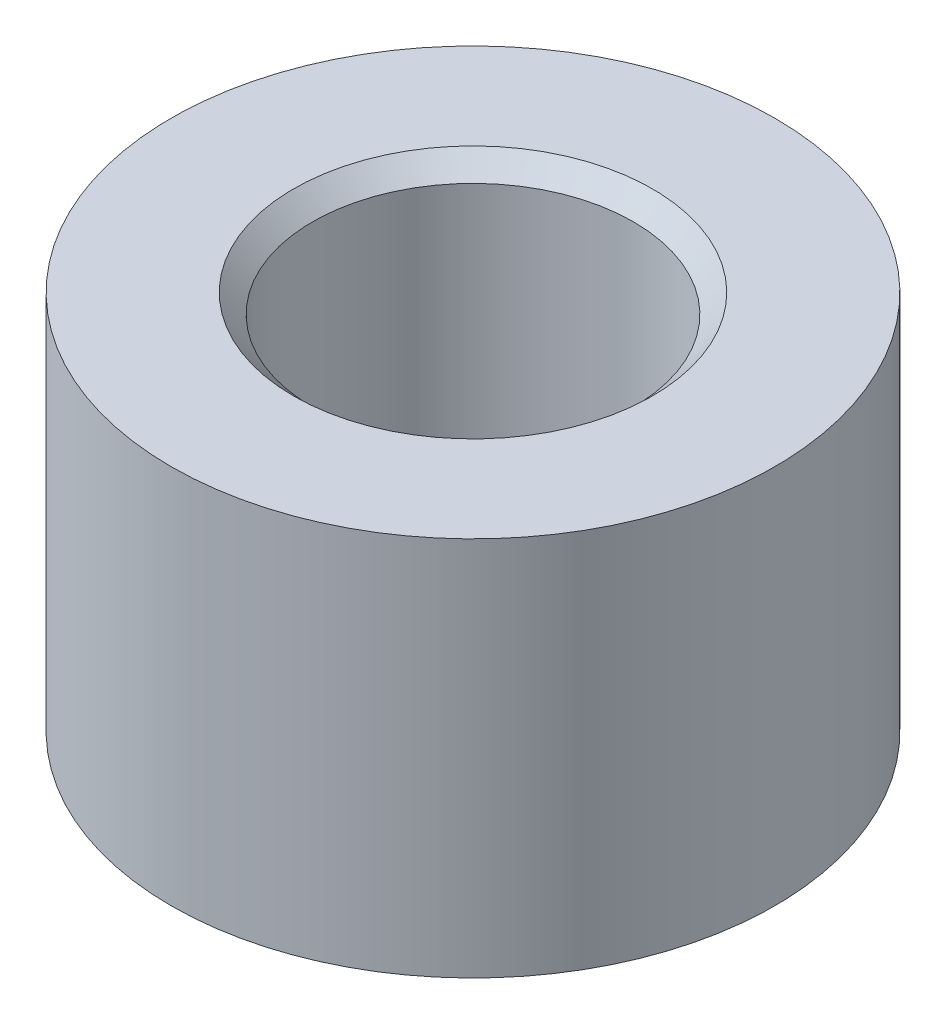
ISO-10303-21;
HEADER;
FILE_DESCRIPTION(('STEP AP214'),'2;1');
FILE_NAME('part.step','',(''),(''),'','','');
FILE_SCHEMA(('AUTOMOTIVE_DESIGN { 1 0 10303 214 1 1 1 1 }'));
ENDSEC;
DATA;
#1=APPLICATION_CONTEXT('core data for automotive mechanical design processes');
#2=APPLICATION_PROTOCOL_DEFINITION('international standard','automotive_design',2000,#1);
#3=PRODUCT_CONTEXT('',#1,'mechanical');
#4=PRODUCT('Part','Part','',(#3));
#5=PRODUCT_RELATED_PRODUCT_CATEGORY('part','',(#4));
#6=PRODUCT_DEFINITION_FORMATION('','',#4);
#7=PRODUCT_DEFINITION_CONTEXT('part definition',#1,'design');
#8=PRODUCT_DEFINITION('design','',#6,#7);
#9=PRODUCT_DEFINITION_SHAPE('','',#8);
#10=(LENGTH_UNIT() NAMED_UNIT(*) SI_UNIT(.MILLI.,.METRE.));
#11=(NAMED_UNIT(*) PLANE_ANGLE_UNIT() SI_UNIT($,.RADIAN.));
#12=(NAMED_UNIT(*) SI_UNIT($,.STERADIAN.) SOLID_ANGLE_UNIT());
#13=UNCERTAINTY_MEASURE_WITH_UNIT(LENGTH_MEASURE(1.E-05),#10,'distance_accuracy_value','');
#14=(GEOMETRIC_REPRESENTATION_CONTEXT(3) GLOBAL_UNCERTAINTY_ASSIGNED_CONTEXT((#13)) GLOBAL_UNIT_ASSIGNED_CONTEXT((#10,
#11,#12)) REPRESENTATION_CONTEXT('',''));
#15=CARTESIAN_POINT('',(0.,0.,0.));
#16=DIRECTION('',(0.,0.,1.));
#17=DIRECTION('',(1.,0.,0.));
#18=AXIS2_PLACEMENT_3D('',#15,#16,#17);
#19=CARTESIAN_POINT('',(0.,8.001,0.));
#20=DIRECTION('',(0.,1.,0.));
#21=DIRECTION('',(0.,0.,1.));
#22=AXIS2_PLACEMENT_3D('',#19,#20,#21);
#23=PLANE('',#22);
#24=CARTESIAN_POINT('',(0.,8.001,0.));
#25=DIRECTION('',(0.,1.,0.));
#26=DIRECTION('',(0.,0.,1.));
#27=AXIS2_PLACEMENT_3D('',#24,#25,#26);
#28=CIRCLE('',#27,3.775);
#29=CARTESIAN_POINT('',(0.,8.001,3.775));
#30=VERTEX_POINT('',#29);
#31=EDGE_CURVE('E10',#30,#30,#28,.F.);
#32=ORIENTED_EDGE('',*,*,#31,.T.);
#33=EDGE_LOOP('',(#32));
#34=FACE_BOUND('',#33,.T.);
#35=CARTESIAN_POINT('',(0.,8.001,0.));
#36=DIRECTION('',(0.,1.,0.));
#37=DIRECTION('',(0.,0.,1.));
#38=AXIS2_PLACEMENT_3D('',#35,#36,#37);
#39=CIRCLE('',#38,6.35);
#40=CARTESIAN_POINT('',(0.,8.001,6.35));
#41=VERTEX_POINT('',#40);
#42=EDGE_CURVE('E51',#41,#41,#39,.T.);
#43=ORIENTED_EDGE('',*,*,#42,.T.);
#44=EDGE_LOOP('',(#43));
#45=FACE_BOUND('',#44,.T.);
#46=ADVANCED_FACE('F31',(#34,#45),#23,.T.);
#47=CARTESIAN_POINT('',(0.,0.,0.));
#48=DIRECTION('',(0.,1.,0.));
#49=DIRECTION('',(0.,0.,1.));
#50=AXIS2_PLACEMENT_3D('',#47,#48,#49);
#51=PLANE('',#50);
#52=CARTESIAN_POINT('',(0.,0.,0.));
#53=DIRECTION('',(0.,1.,0.));
#54=DIRECTION('',(0.,0.,1.));
#55=AXIS2_PLACEMENT_3D('',#52,#53,#54);
#56=CIRCLE('',#55,3.775);
#57=CARTESIAN_POINT('',(0.,0.,-3.775));
#58=VERTEX_POINT('',#57);
#59=EDGE_CURVE('E46',#58,#58,#56,.T.);
#60=ORIENTED_EDGE('',*,*,#59,.T.);
#61=EDGE_LOOP('',(#60));
#62=FACE_BOUND('',#61,.T.);
#63=CARTESIAN_POINT('',(0.,0.,0.));
#64=DIRECTION('',(0.,1.,0.));
#65=DIRECTION('',(0.,0.,1.));
#66=AXIS2_PLACEMENT_3D('',#63,#64,#65);
#67=CIRCLE('',#66,6.35);
#68=CARTESIAN_POINT('',(0.,0.,6.35));
#69=VERTEX_POINT('',#68);
#70=EDGE_CURVE('E52',#69,#69,#67,.T.);
#71=ORIENTED_EDGE('',*,*,#70,.F.);
#72=EDGE_LOOP('',(#71));
#73=FACE_BOUND('',#72,.T.);
#74=ADVANCED_FACE('F63',(#62,#73),#51,.F.);
#75=CARTESIAN_POINT('',(0.,8.001,0.));
#76=DIRECTION('',(0.,-1.,0.));
#77=DIRECTION('',(0.,0.,-1.));
#78=AXIS2_PLACEMENT_3D('',#75,#76,#77);
#79=CYLINDRICAL_SURFACE('',#78,6.35);
#80=ORIENTED_EDGE('',*,*,#42,.F.);
#81=EDGE_LOOP('',(#80));
#82=FACE_BOUND('',#81,.T.);
#83=ORIENTED_EDGE('',*,*,#70,.T.);
#84=EDGE_LOOP('',(#83));
#85=FACE_BOUND('',#84,.T.);
#86=ADVANCED_FACE('F59',(#82,#85),#79,.T.);
#87=CARTESIAN_POINT('',(0.,8.001,0.));
#88=DIRECTION('',(0.,-1.,0.));
#89=DIRECTION('',(0.,0.,-1.));
#90=AXIS2_PLACEMENT_3D('',#87,#88,#89);
#91=CYLINDRICAL_SURFACE('',#90,3.375);
#92=CARTESIAN_POINT('',(0.,0.399999999999998,0.));
#93=DIRECTION('',(0.,1.,0.));
#94=DIRECTION('',(0.,0.,1.));
#95=AXIS2_PLACEMENT_3D('',#92,#93,#94);
#96=CIRCLE('',#95,3.375);
#97=CARTESIAN_POINT('',(0.,0.399999999999998,-3.375));
#98=VERTEX_POINT('',#97);
#99=EDGE_CURVE('E38',#98,#98,#96,.F.);
#100=CARTESIAN_POINT('',(0.,7.601,0.));
#101=DIRECTION('',(0.,1.,0.));
#102=DIRECTION('',(0.,0.,1.));
#103=AXIS2_PLACEMENT_3D('',#100,#101,#102);
#104=CIRCLE('',#103,3.375);
#105=CARTESIAN_POINT('',(0.,7.601,-3.375));
#106=VERTEX_POINT('',#105);
#107=EDGE_CURVE('E42',#106,#106,#104,.T.);
#108=CARTESIAN_POINT('',(0.,0.399999999999998,-3.375));
#109=CARTESIAN_POINT('',(0.,0.475010416666664,-3.375));
#110=CARTESIAN_POINT('',(0.,0.550020833333331,-3.375));
#111=CARTESIAN_POINT('',(0.,0.700041666666665,-3.375));
#112=CARTESIAN_POINT('',(0.,0.775052083333331,-3.375));
#113=CARTESIAN_POINT('',(0.,0.925072916666664,-3.375));
#114=CARTESIAN_POINT('',(0.,1.00008333333333,-3.375));
#115=CARTESIAN_POINT('',(0.,1.15010416666666,-3.375));
#116=CARTESIAN_POINT('',(0.,1.22511458333333,-3.375));
#117=CARTESIAN_POINT('',(0.,1.37513541666666,-3.375));
#118=CARTESIAN_POINT('',(0.,1.45014583333333,-3.375));
#119=CARTESIAN_POINT('',(0.,1.60016666666666,-3.375));
#120=CARTESIAN_POINT('',(0.,1.67517708333333,-3.375));
#121=CARTESIAN_POINT('',(0.,1.82519791666666,-3.375));
#122=CARTESIAN_POINT('',(0.,1.90020833333333,-3.375));
#123=CARTESIAN_POINT('',(0.,2.05022916666667,-3.375));
#124=CARTESIAN_POINT('',(0.,2.12523958333333,-3.375));
#125=CARTESIAN_POINT('',(0.,2.27526041666666,-3.375));
#126=CARTESIAN_POINT('',(0.,2.35027083333333,-3.375));
#127=CARTESIAN_POINT('',(0.,2.50029166666666,-3.375));
#128=CARTESIAN_POINT('',(0.,2.57530208333333,-3.375));
#129=CARTESIAN_POINT('',(0.,2.72532291666667,-3.375));
#130=CARTESIAN_POINT('',(0.,2.80033333333333,-3.375));
#131=CARTESIAN_POINT('',(0.,2.95035416666667,-3.375));
#132=CARTESIAN_POINT('',(0.,3.02536458333333,-3.375));
#133=CARTESIAN_POINT('',(0.,3.17538541666667,-3.375));
#134=CARTESIAN_POINT('',(0.,3.25039583333333,-3.375));
#135=CARTESIAN_POINT('',(0.,3.40041666666667,-3.375));
#136=CARTESIAN_POINT('',(0.,3.47542708333333,-3.375));
#137=CARTESIAN_POINT('',(0.,3.62544791666667,-3.375));
#138=CARTESIAN_POINT('',(0.,3.70045833333333,-3.375));
#139=CARTESIAN_POINT('',(0.,3.85047916666667,-3.375));
#140=CARTESIAN_POINT('',(0.,3.92548958333333,-3.375));
#141=CARTESIAN_POINT('',(0.,4.07551041666667,-3.375));
#142=CARTESIAN_POINT('',(0.,4.15052083333333,-3.375));
#143=CARTESIAN_POINT('',(0.,4.30054166666667,-3.375));
#144=CARTESIAN_POINT('',(0.,4.37555208333333,-3.375));
#145=CARTESIAN_POINT('',(0.,4.52557291666667,-3.375));
#146=CARTESIAN_POINT('',(0.,4.60058333333333,-3.375));
#147=CARTESIAN_POINT('',(0.,4.75060416666667,-3.375));
#148=CARTESIAN_POINT('',(0.,4.82561458333333,-3.375));
#149=CARTESIAN_POINT('',(0.,4.97563541666667,-3.375));
#150=CARTESIAN_POINT('',(0.,5.05064583333333,-3.375));
#151=CARTESIAN_POINT('',(0.,5.20066666666667,-3.375));
#152=CARTESIAN_POINT('',(0.,5.27567708333333,-3.375));
#153=CARTESIAN_POINT('',(0.,5.42569791666667,-3.375));
#154=CARTESIAN_POINT('',(0.,5.50070833333333,-3.375));
#155=CARTESIAN_POINT('',(0.,5.65072916666667,-3.375));
#156=CARTESIAN_POINT('',(0.,5.72573958333333,-3.375));
#157=CARTESIAN_POINT('',(0.,5.87576041666667,-3.375));
#158=CARTESIAN_POINT('',(0.,5.95077083333333,-3.375));
#159=CARTESIAN_POINT('',(0.,6.10079166666667,-3.375));
#160=CARTESIAN_POINT('',(0.,6.17580208333333,-3.375));
#161=CARTESIAN_POINT('',(0.,6.32582291666667,-3.375));
#162=CARTESIAN_POINT('',(0.,6.40083333333333,-3.375));
#163=CARTESIAN_POINT('',(0.,6.55085416666667,-3.375));
#164=CARTESIAN_POINT('',(0.,6.62586458333333,-3.375));
#165=CARTESIAN_POINT('',(0.,6.77588541666667,-3.375));
#166=CARTESIAN_POINT('',(0.,6.85089583333333,-3.375));
#167=CARTESIAN_POINT('',(0.,7.00091666666667,-3.375));
#168=CARTESIAN_POINT('',(0.,7.07592708333333,-3.375));
#169=CARTESIAN_POINT('',(0.,7.22594791666667,-3.375));
#170=CARTESIAN_POINT('',(0.,7.30095833333333,-3.375));
#171=CARTESIAN_POINT('',(0.,7.45097916666667,-3.375));
#172=CARTESIAN_POINT('',(0.,7.52598958333333,-3.375));
#173=CARTESIAN_POINT('',(0.,7.601,-3.375));
#174=B_SPLINE_CURVE_WITH_KNOTS('',3,(#108,#109,#110,#111,#112,#113,#114,#115,#116,#117,#118,
#119,#120,#121,#122,#123,#124,#125,#126,#127,#128,#129,#130,#131,#132,#133,#134,#135,#136,#137,
#138,#139,#140,#141,#142,#143,#144,#145,#146,#147,#148,#149,#150,#151,#152,#153,#154,#155,#156,
#157,#158,#159,#160,#161,#162,#163,#164,#165,#166,#167,#168,#169,#170,#171,#172,#173),
.UNSPECIFIED.,.F.,.F.,(4,2,2,2,2,2,2,2,2,2,2,2,2,2,2,2,2,2,2,2,2,2,2,2,2,2,2,2,2,2,2,2,4),(0.,
0.22503125,0.4500625,0.67509375,0.900125,1.12515625,1.3501875,1.57521875,1.80025,2.02528125,
2.2503125,2.47534375,2.700375,2.92540625,3.1504375,3.37546875,3.6005,3.82553125,4.0505625,
4.27559375,4.500625,4.72565625,4.9506875,5.17571875,5.40075,5.62578125,5.8508125,6.07584375,
6.300875,6.52590625,6.7509375,6.97596875,7.201),.UNSPECIFIED.);
#175=EDGE_CURVE('BSEAM62',#98,#106,#174,.T.);
#176=ORIENTED_EDGE('',*,*,#99,.T.);
#177=ORIENTED_EDGE('',*,*,#107,.T.);
#178=ORIENTED_EDGE('',*,*,#175,.T.);
#179=ORIENTED_EDGE('',*,*,#175,.F.);
#180=EDGE_LOOP('',(#176,#178,#177,#179));
#181=FACE_BOUND('',#180,.T.);
#182=ADVANCED_FACE('F62',(#181),#91,.F.);
#183=CARTESIAN_POINT('',(0.,0.,0.));
#184=DIRECTION('',(0.,-1.,0.));
#185=DIRECTION('',(0.,0.,-1.));
#186=AXIS2_PLACEMENT_3D('',#183,#184,#185);
#187=CONICAL_SURFACE('',#186,3.775,0.785398163397447);
#188=CARTESIAN_POINT('',(0.,0.399999999999998,-3.375));
#189=CARTESIAN_POINT('',(0.,0.395833333333332,-3.37916666666667));
#190=CARTESIAN_POINT('',(0.,0.391666666666665,-3.38333333333333));
#191=CARTESIAN_POINT('',(0.,0.383333333333332,-3.39166666666667));
#192=CARTESIAN_POINT('',(0.,0.379166666666665,-3.39583333333333));
#193=CARTESIAN_POINT('',(0.,0.370833333333332,-3.40416666666667));
#194=CARTESIAN_POINT('',(0.,0.366666666666665,-3.40833333333333));
#195=CARTESIAN_POINT('',(0.,0.358333333333332,-3.41666666666667));
#196=CARTESIAN_POINT('',(0.,0.354166666666665,-3.42083333333333));
#197=CARTESIAN_POINT('',(0.,0.345833333333332,-3.42916666666667));
#198=CARTESIAN_POINT('',(0.,0.341666666666665,-3.43333333333333));
#199=CARTESIAN_POINT('',(0.,0.333333333333332,-3.44166666666667));
#200=CARTESIAN_POINT('',(0.,0.329166666666665,-3.44583333333333));
#201=CARTESIAN_POINT('',(0.,0.320833333333332,-3.45416666666667));
#202=CARTESIAN_POINT('',(0.,0.316666666666665,-3.45833333333333));
#203=CARTESIAN_POINT('',(0.,0.308333333333332,-3.46666666666667));
#204=CARTESIAN_POINT('',(0.,0.304166666666665,-3.47083333333333));
#205=CARTESIAN_POINT('',(0.,0.295833333333332,-3.47916666666667));
#206=CARTESIAN_POINT('',(0.,0.291666666666666,-3.48333333333333));
#207=CARTESIAN_POINT('',(0.,0.283333333333332,-3.49166666666667));
#208=CARTESIAN_POINT('',(0.,0.279166666666666,-3.49583333333333));
#209=CARTESIAN_POINT('',(0.,0.270833333333332,-3.50416666666667));
#210=CARTESIAN_POINT('',(0.,0.266666666666666,-3.50833333333333));
#211=CARTESIAN_POINT('',(0.,0.258333333333332,-3.51666666666667));
#212=CARTESIAN_POINT('',(0.,0.254166666666666,-3.52083333333333));
#213=CARTESIAN_POINT('',(0.,0.245833333333332,-3.52916666666667));
#214=CARTESIAN_POINT('',(0.,0.241666666666666,-3.53333333333333));
#215=CARTESIAN_POINT('',(0.,0.233333333333332,-3.54166666666667));
#216=CARTESIAN_POINT('',(0.,0.229166666666666,-3.54583333333333));
#217=CARTESIAN_POINT('',(0.,0.220833333333332,-3.55416666666667));
#218=CARTESIAN_POINT('',(0.,0.216666666666666,-3.55833333333333));
#219=CARTESIAN_POINT('',(0.,0.208333333333333,-3.56666666666667));
#220=CARTESIAN_POINT('',(0.,0.204166666666666,-3.57083333333333));
#221=CARTESIAN_POINT('',(0.,0.195833333333333,-3.57916666666667));
#222=CARTESIAN_POINT('',(0.,0.191666666666666,-3.58333333333333));
#223=CARTESIAN_POINT('',(0.,0.183333333333333,-3.59166666666667));
#224=CARTESIAN_POINT('',(0.,0.179166666666666,-3.59583333333333));
#225=CARTESIAN_POINT('',(0.,0.170833333333333,-3.60416666666666));
#226=CARTESIAN_POINT('',(0.,0.166666666666666,-3.60833333333333));
#227=CARTESIAN_POINT('',(0.,0.158333333333333,-3.61666666666666));
#228=CARTESIAN_POINT('',(0.,0.154166666666666,-3.62083333333333));
#229=CARTESIAN_POINT('',(0.,0.145833333333333,-3.62916666666666));
#230=CARTESIAN_POINT('',(0.,0.141666666666666,-3.63333333333333));
#231=CARTESIAN_POINT('',(0.,0.133333333333333,-3.64166666666666));
#232=CARTESIAN_POINT('',(0.,0.129166666666666,-3.64583333333333));
#233=CARTESIAN_POINT('',(0.,0.120833333333333,-3.65416666666666));
#234=CARTESIAN_POINT('',(0.,0.116666666666666,-3.65833333333333));
#235=CARTESIAN_POINT('',(0.,0.108333333333333,-3.66666666666666));
#236=CARTESIAN_POINT('',(0.,0.104166666666666,-3.67083333333333));
#237=CARTESIAN_POINT('',(0.,0.095833333333333,-3.67916666666666));
#238=CARTESIAN_POINT('',(0.,0.0916666666666663,-3.68333333333333));
#239=CARTESIAN_POINT('',(0.,0.083333333333333,-3.69166666666666));
#240=CARTESIAN_POINT('',(0.,0.0791666666666664,-3.69583333333333));
#241=CARTESIAN_POINT('',(0.,0.070833333333333,-3.70416666666666));
#242=CARTESIAN_POINT('',(0.,0.0666666666666664,-3.70833333333333));
#243=CARTESIAN_POINT('',(0.,0.0583333333333331,-3.71666666666666));
#244=CARTESIAN_POINT('',(0.,0.0541666666666664,-3.72083333333333));
#245=CARTESIAN_POINT('',(0.,0.0458333333333332,-3.72916666666666));
#246=CARTESIAN_POINT('',(0.,0.0416666666666665,-3.73333333333333));
#247=CARTESIAN_POINT('',(0.,0.0333333333333332,-3.74166666666666));
#248=CARTESIAN_POINT('',(0.,0.0291666666666666,-3.74583333333333));
#249=CARTESIAN_POINT('',(0.,0.0208333333333332,-3.75416666666666));
#250=CARTESIAN_POINT('',(0.,0.0166666666666666,-3.75833333333333));
#251=CARTESIAN_POINT('',(0.,0.00833333333333328,-3.76666666666666));
#252=CARTESIAN_POINT('',(0.,0.00416666666666664,-3.77083333333333));
#253=CARTESIAN_POINT('',(0.,0.,-3.775));
#254=B_SPLINE_CURVE_WITH_KNOTS('',3,(#188,#189,#190,#191,#192,#193,#194,#195,#196,#197,#198,
#199,#200,#201,#202,#203,#204,#205,#206,#207,#208,#209,#210,#211,#212,#213,#214,#215,#216,#217,
#218,#219,#220,#221,#222,#223,#224,#225,#226,#227,#228,#229,#230,#231,#232,#233,#234,#235,#236,
#237,#238,#239,#240,#241,#242,#243,#244,#245,#246,#247,#248,#249,#250,#251,#252,#253),
.UNSPECIFIED.,.F.,.F.,(4,2,2,2,2,2,2,2,2,2,2,2,2,2,2,2,2,2,2,2,2,2,2,2,2,2,2,2,2,2,2,2,4),(0.,
0.0176776695296636,0.0353553390593272,0.0530330085889908,0.0707106781186544,0.088388347648318,
0.106066017177982,0.123743686707645,0.141421356237309,0.159099025766972,0.176776695296636,
0.1944543648263,0.212132034355963,0.229809703885627,0.24748737341529,0.265165042944954,
0.282842712474618,0.300520382004281,0.318198051533944,0.335875721063608,0.353553390593272,
0.371231060122935,0.388908729652599,0.406586399182263,0.424264068711926,0.44194173824159,
0.459619407771253,0.477297077300917,0.49497474683058,0.512652416360244,0.530330085889908,
0.548007755419571,0.565685424949235),.UNSPECIFIED.);
#255=EDGE_CURVE('BSEAM75',#98,#58,#254,.T.);
#256=ORIENTED_EDGE('',*,*,#99,.F.);
#257=ORIENTED_EDGE('',*,*,#59,.F.);
#258=ORIENTED_EDGE('',*,*,#255,.T.);
#259=ORIENTED_EDGE('',*,*,#255,.F.);
#260=EDGE_LOOP('',(#256,#258,#257,#259));
#261=FACE_BOUND('',#260,.T.);
#262=ADVANCED_FACE('F75',(#261),#187,.F.);
#263=CARTESIAN_POINT('',(0.,7.601,0.));
#264=DIRECTION('',(0.,1.,0.));
#265=DIRECTION('',(0.,0.,1.));
#266=AXIS2_PLACEMENT_3D('',#263,#264,#265);
#267=CONICAL_SURFACE('',#266,3.375,0.78539816339745);
#268=ORIENTED_EDGE('',*,*,#31,.F.);
#269=EDGE_LOOP('',(#268));
#270=FACE_BOUND('',#269,.T.);
#271=ORIENTED_EDGE('',*,*,#107,.F.);
#272=EDGE_LOOP('',(#271));
#273=FACE_BOUND('',#272,.T.);
#274=ADVANCED_FACE('F33',(#270,#273),#267,.F.);
#275=CLOSED_SHELL('',(#46,#74,#86,#182,#262,#274));
#276=MANIFOLD_SOLID_BREP('B2',#275);
#277=ADVANCED_BREP_SHAPE_REPRESENTATION('',(#18,#276),#14);
#278=SHAPE_DEFINITION_REPRESENTATION(#9,#277);
ENDSEC;
END-ISO-10303-21;
